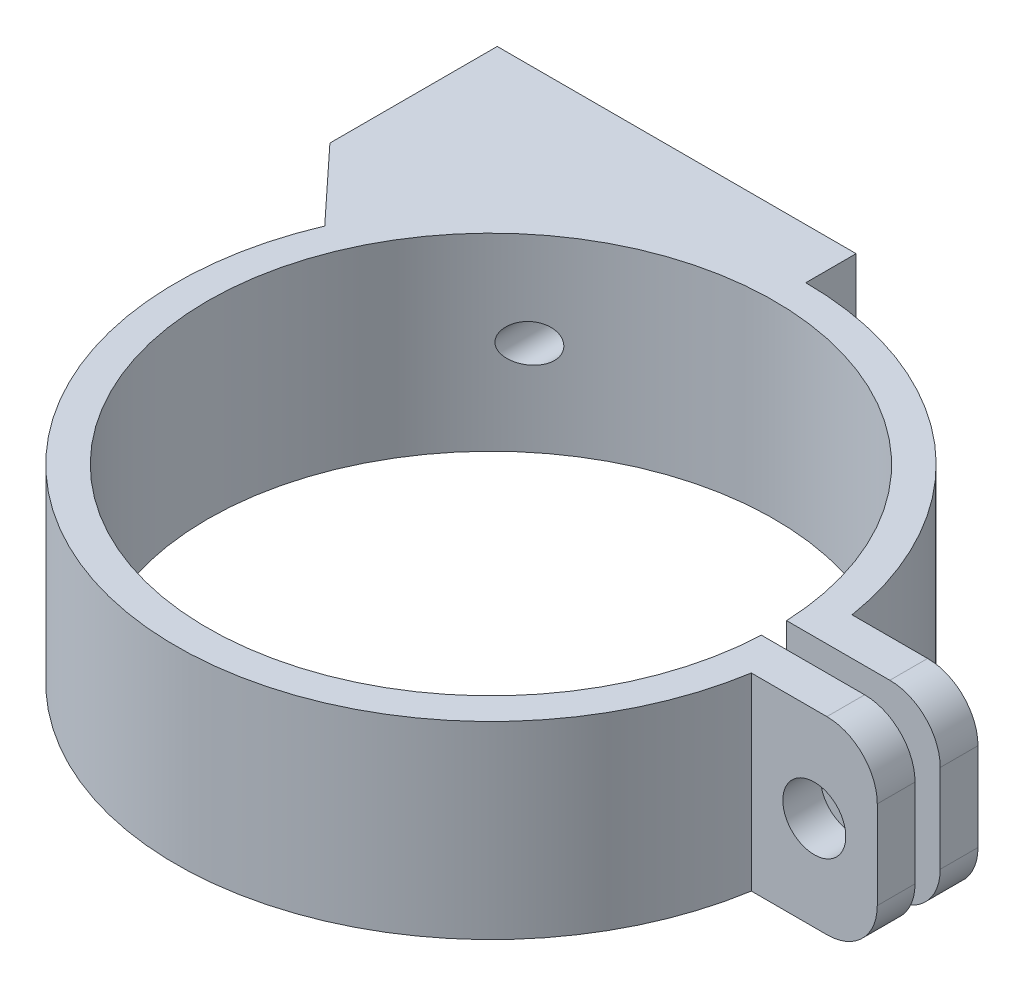
ISO-10303-21;
HEADER;
FILE_DESCRIPTION(('STEP AP214'),'2;1');
FILE_NAME('part.step','',(''),(''),'','','');
FILE_SCHEMA(('AUTOMOTIVE_DESIGN { 1 0 10303 214 1 1 1 1 }'));
ENDSEC;
DATA;
#1=APPLICATION_CONTEXT('core data for automotive mechanical design processes');
#2=APPLICATION_PROTOCOL_DEFINITION('international standard','automotive_design',2000,#1);
#3=PRODUCT_CONTEXT('',#1,'mechanical');
#4=PRODUCT('Part','Part','',(#3));
#5=PRODUCT_RELATED_PRODUCT_CATEGORY('part','',(#4));
#6=PRODUCT_DEFINITION_FORMATION('','',#4);
#7=PRODUCT_DEFINITION_CONTEXT('part definition',#1,'design');
#8=PRODUCT_DEFINITION('design','',#6,#7);
#9=PRODUCT_DEFINITION_SHAPE('','',#8);
#10=(LENGTH_UNIT() NAMED_UNIT(*) SI_UNIT(.MILLI.,.METRE.));
#11=(NAMED_UNIT(*) PLANE_ANGLE_UNIT() SI_UNIT($,.RADIAN.));
#12=(NAMED_UNIT(*) SI_UNIT($,.STERADIAN.) SOLID_ANGLE_UNIT());
#13=UNCERTAINTY_MEASURE_WITH_UNIT(LENGTH_MEASURE(1.E-05),#10,'distance_accuracy_value','');
#14=(GEOMETRIC_REPRESENTATION_CONTEXT(3) GLOBAL_UNCERTAINTY_ASSIGNED_CONTEXT((#13)) GLOBAL_UNIT_ASSIGNED_CONTEXT((#10,
#11,#12)) REPRESENTATION_CONTEXT('',''));
#15=CARTESIAN_POINT('',(0.,0.,0.));
#16=DIRECTION('',(0.,0.,1.));
#17=DIRECTION('',(1.,0.,0.));
#18=AXIS2_PLACEMENT_3D('',#15,#16,#17);
#19=CARTESIAN_POINT('',(0.,15.,0.));
#20=DIRECTION('',(0.,-1.,0.));
#21=DIRECTION('',(0.,0.,-1.));
#22=AXIS2_PLACEMENT_3D('',#19,#20,#21);
#23=CYLINDRICAL_SURFACE('',#22,25.);
#24=CARTESIAN_POINT('',(0.,0.,0.));
#25=DIRECTION('',(0.,1.,0.));
#26=DIRECTION('',(0.,0.,1.));
#27=AXIS2_PLACEMENT_3D('',#24,#25,#26);
#28=CIRCLE('',#27,25.);
#29=CARTESIAN_POINT('',(24.6779253585061,0.,-4.));
#30=VERTEX_POINT('',#29);
#31=CARTESIAN_POINT('',(0.,0.,-25.));
#32=VERTEX_POINT('',#31);
#33=EDGE_CURVE('E181',#30,#32,#28,.T.);
#34=ORIENTED_EDGE('',*,*,#33,.T.);
#35=DIRECTION('',(0.,-1.,0.));
#36=VECTOR('',#35,1.);
#37=CARTESIAN_POINT('',(0.,15.,-25.));
#38=LINE('',#37,#36);
#39=CARTESIAN_POINT('',(0.,15.,-25.));
#40=VERTEX_POINT('',#39);
#41=EDGE_CURVE('E161',#40,#32,#38,.T.);
#42=ORIENTED_EDGE('',*,*,#41,.F.);
#43=CARTESIAN_POINT('',(0.,15.,0.));
#44=DIRECTION('',(0.,1.,0.));
#45=DIRECTION('',(0.,0.,1.));
#46=AXIS2_PLACEMENT_3D('',#43,#44,#45);
#47=CIRCLE('',#46,25.);
#48=CARTESIAN_POINT('',(24.6779253585061,15.,-4.));
#49=VERTEX_POINT('',#48);
#50=EDGE_CURVE('E168',#49,#40,#47,.T.);
#51=ORIENTED_EDGE('',*,*,#50,.F.);
#52=DIRECTION('',(0.,-1.,0.));
#53=VECTOR('',#52,1.);
#54=CARTESIAN_POINT('',(24.6779253585061,15.,-4.));
#55=LINE('',#54,#53);
#56=EDGE_CURVE('E284',#49,#30,#55,.T.);
#57=ORIENTED_EDGE('',*,*,#56,.T.);
#58=EDGE_LOOP('',(#34,#42,#51,#57));
#59=FACE_BOUND('',#58,.T.);
#60=ADVANCED_FACE('F35',(#59),#23,.T.);
#61=CARTESIAN_POINT('',(0.,15.,-25.));
#62=DIRECTION('',(-1.,0.,0.));
#63=DIRECTION('',(0.,0.,1.));
#64=AXIS2_PLACEMENT_3D('',#61,#62,#63);
#65=PLANE('',#64);
#66=DIRECTION('',(0.,0.,-1.));
#67=VECTOR('',#66,1.);
#68=CARTESIAN_POINT('',(0.,0.,-25.));
#69=LINE('',#68,#67);
#70=CARTESIAN_POINT('',(0.,0.,-29.));
#71=VERTEX_POINT('',#70);
#72=EDGE_CURVE('E293',#32,#71,#69,.T.);
#73=ORIENTED_EDGE('',*,*,#72,.T.);
#74=DIRECTION('',(0.,-1.,0.));
#75=VECTOR('',#74,1.);
#76=CARTESIAN_POINT('',(0.,15.,-29.));
#77=LINE('',#76,#75);
#78=CARTESIAN_POINT('',(0.,15.,-29.));
#79=VERTEX_POINT('',#78);
#80=EDGE_CURVE('E164',#79,#71,#77,.T.);
#81=ORIENTED_EDGE('',*,*,#80,.F.);
#82=DIRECTION('',(0.,0.,-1.));
#83=VECTOR('',#82,1.);
#84=CARTESIAN_POINT('',(0.,15.,-25.));
#85=LINE('',#84,#83);
#86=EDGE_CURVE('E157',#40,#79,#85,.T.);
#87=ORIENTED_EDGE('',*,*,#86,.F.);
#88=ORIENTED_EDGE('',*,*,#41,.T.);
#89=EDGE_LOOP('',(#73,#81,#87,#88));
#90=FACE_BOUND('',#89,.T.);
#91=ADVANCED_FACE('F159',(#90),#65,.F.);
#92=CARTESIAN_POINT('',(0.,15.,-29.));
#93=DIRECTION('',(0.,0.,1.));
#94=DIRECTION('',(1.,0.,0.));
#95=AXIS2_PLACEMENT_3D('',#92,#93,#94);
#96=PLANE('',#95);
#97=CARTESIAN_POINT('',(-14.25,7.5,-29.));
#98=DIRECTION('',(0.,0.,-1.));
#99=DIRECTION('',(-1.,0.,0.));
#100=AXIS2_PLACEMENT_3D('',#97,#98,#99);
#101=CIRCLE('',#100,1.5);
#102=CARTESIAN_POINT('',(-15.75,7.5,-29.));
#103=VERTEX_POINT('',#102);
#104=EDGE_CURVE('E197',#103,#103,#101,.T.);
#105=ORIENTED_EDGE('',*,*,#104,.F.);
#106=EDGE_LOOP('',(#105));
#107=FACE_BOUND('',#106,.T.);
#108=DIRECTION('',(-1.,0.,0.));
#109=VECTOR('',#108,1.);
#110=CARTESIAN_POINT('',(0.,0.,-29.));
#111=LINE('',#110,#109);
#112=CARTESIAN_POINT('',(-28.5,0.,-29.));
#113=VERTEX_POINT('',#112);
#114=EDGE_CURVE('E295',#71,#113,#111,.T.);
#115=ORIENTED_EDGE('',*,*,#114,.T.);
#116=DIRECTION('',(0.,-1.,0.));
#117=VECTOR('',#116,1.);
#118=CARTESIAN_POINT('',(-28.5,15.,-29.));
#119=LINE('',#118,#117);
#120=CARTESIAN_POINT('',(-28.5,15.,-29.));
#121=VERTEX_POINT('',#120);
#122=EDGE_CURVE('E186',#121,#113,#119,.T.);
#123=ORIENTED_EDGE('',*,*,#122,.F.);
#124=DIRECTION('',(-1.,0.,0.));
#125=VECTOR('',#124,1.);
#126=CARTESIAN_POINT('',(0.,15.,-29.));
#127=LINE('',#126,#125);
#128=EDGE_CURVE('E167',#79,#121,#127,.T.);
#129=ORIENTED_EDGE('',*,*,#128,.F.);
#130=ORIENTED_EDGE('',*,*,#80,.T.);
#131=EDGE_LOOP('',(#115,#123,#129,#130));
#132=FACE_BOUND('',#131,.T.);
#133=ADVANCED_FACE('F238',(#107,#132),#96,.F.);
#134=CARTESIAN_POINT('',(-28.5,15.,-29.));
#135=DIRECTION('',(1.,0.,0.));
#136=DIRECTION('',(0.,0.,-1.));
#137=AXIS2_PLACEMENT_3D('',#134,#135,#136);
#138=PLANE('',#137);
#139=DIRECTION('',(0.,0.,1.));
#140=VECTOR('',#139,1.);
#141=CARTESIAN_POINT('',(-28.5,0.,-29.));
#142=LINE('',#141,#140);
#143=CARTESIAN_POINT('',(-28.5,0.,-15.7122905027933));
#144=VERTEX_POINT('',#143);
#145=EDGE_CURVE('E297',#113,#144,#142,.T.);
#146=ORIENTED_EDGE('',*,*,#145,.T.);
#147=DIRECTION('',(0.,-1.,0.));
#148=VECTOR('',#147,1.);
#149=CARTESIAN_POINT('',(-28.5,15.,-15.7122905027933));
#150=LINE('',#149,#148);
#151=CARTESIAN_POINT('',(-28.5,15.,-15.7122905027933));
#152=VERTEX_POINT('',#151);
#153=EDGE_CURVE('E336',#152,#144,#150,.T.);
#154=ORIENTED_EDGE('',*,*,#153,.F.);
#155=DIRECTION('',(0.,0.,1.));
#156=VECTOR('',#155,1.);
#157=CARTESIAN_POINT('',(-28.5,15.,-29.));
#158=LINE('',#157,#156);
#159=EDGE_CURVE('E345',#121,#152,#158,.T.);
#160=ORIENTED_EDGE('',*,*,#159,.F.);
#161=ORIENTED_EDGE('',*,*,#122,.T.);
#162=EDGE_LOOP('',(#146,#154,#160,#161));
#163=FACE_BOUND('',#162,.T.);
#164=ADVANCED_FACE('F343',(#163),#138,.F.);
#165=CARTESIAN_POINT('',(-28.5,15.,-15.7122905027933));
#166=DIRECTION('',(0.732073628459375,0.,-0.681225515166839));
#167=DIRECTION('',(-0.681225515166839,0.,-0.732073628459375));
#168=AXIS2_PLACEMENT_3D('',#165,#166,#167);
#169=PLANE('',#168);
#170=DIRECTION('',(0.681225515166839,0.,0.732073628459375));
#171=VECTOR('',#170,1.);
#172=CARTESIAN_POINT('',(-28.5,0.,-15.7122905027933));
#173=LINE('',#172,#171);
#174=CARTESIAN_POINT('',(-22.9988894708076,0.,-9.8005654484614));
#175=VERTEX_POINT('',#174);
#176=EDGE_CURVE('E299',#144,#175,#173,.T.);
#177=ORIENTED_EDGE('',*,*,#176,.T.);
#178=DIRECTION('',(0.,-1.,0.));
#179=VECTOR('',#178,1.);
#180=CARTESIAN_POINT('',(-22.9988894708076,15.,-9.8005654484614));
#181=LINE('',#180,#179);
#182=CARTESIAN_POINT('',(-22.9988894708076,15.,-9.8005654484614));
#183=VERTEX_POINT('',#182);
#184=EDGE_CURVE('E333',#183,#175,#181,.T.);
#185=ORIENTED_EDGE('',*,*,#184,.F.);
#186=DIRECTION('',(0.681225515166839,0.,0.732073628459375));
#187=VECTOR('',#186,1.);
#188=CARTESIAN_POINT('',(-28.5,15.,-15.7122905027933));
#189=LINE('',#188,#187);
#190=EDGE_CURVE('E362',#152,#183,#189,.T.);
#191=ORIENTED_EDGE('',*,*,#190,.F.);
#192=ORIENTED_EDGE('',*,*,#153,.T.);
#193=EDGE_LOOP('',(#177,#185,#191,#192));
#194=FACE_BOUND('',#193,.T.);
#195=ADVANCED_FACE('F354',(#194),#169,.F.);
#196=CARTESIAN_POINT('',(0.,15.,0.));
#197=DIRECTION('',(0.,-1.,0.));
#198=DIRECTION('',(0.,0.,-1.));
#199=AXIS2_PLACEMENT_3D('',#196,#197,#198);
#200=CYLINDRICAL_SURFACE('',#199,25.);
#201=CARTESIAN_POINT('',(0.,0.,0.));
#202=DIRECTION('',(0.,1.,0.));
#203=DIRECTION('',(0.,0.,1.));
#204=AXIS2_PLACEMENT_3D('',#201,#202,#203);
#205=CIRCLE('',#204,25.);
#206=CARTESIAN_POINT('',(24.6779253585061,0.,3.99999999999999));
#207=VERTEX_POINT('',#206);
#208=EDGE_CURVE('E301',#175,#207,#205,.T.);
#209=ORIENTED_EDGE('',*,*,#208,.T.);
#210=DIRECTION('',(0.,-1.,0.));
#211=VECTOR('',#210,1.);
#212=CARTESIAN_POINT('',(24.6779253585061,15.,3.99999999999999));
#213=LINE('',#212,#211);
#214=CARTESIAN_POINT('',(24.6779253585061,15.,3.99999999999999));
#215=VERTEX_POINT('',#214);
#216=EDGE_CURVE('E330',#215,#207,#213,.T.);
#217=ORIENTED_EDGE('',*,*,#216,.F.);
#218=CARTESIAN_POINT('',(0.,15.,0.));
#219=DIRECTION('',(0.,1.,0.));
#220=DIRECTION('',(0.,0.,1.));
#221=AXIS2_PLACEMENT_3D('',#218,#219,#220);
#222=CIRCLE('',#221,25.);
#223=EDGE_CURVE('E360',#183,#215,#222,.T.);
#224=ORIENTED_EDGE('',*,*,#223,.F.);
#225=ORIENTED_EDGE('',*,*,#184,.T.);
#226=EDGE_LOOP('',(#209,#217,#224,#225));
#227=FACE_BOUND('',#226,.T.);
#228=ADVANCED_FACE('F358',(#227),#200,.T.);
#229=CARTESIAN_POINT('',(34.6779253585061,15.,4.));
#230=DIRECTION('',(0.,0.,-1.));
#231=DIRECTION('',(-1.,0.,0.));
#232=AXIS2_PLACEMENT_3D('',#229,#230,#231);
#233=PLANE('',#232);
#234=CARTESIAN_POINT('',(29.6779253585061,7.5,4.));
#235=DIRECTION('',(0.,0.,-1.));
#236=DIRECTION('',(-1.,0.,0.));
#237=AXIS2_PLACEMENT_3D('',#234,#235,#236);
#238=CIRCLE('',#237,2.5);
#239=CARTESIAN_POINT('',(27.1779253585061,7.5,4.));
#240=VERTEX_POINT('',#239);
#241=EDGE_CURVE('E384',#240,#240,#238,.T.);
#242=ORIENTED_EDGE('',*,*,#241,.T.);
#243=EDGE_LOOP('',(#242));
#244=FACE_BOUND('',#243,.T.);
#245=DIRECTION('',(1.,0.,0.));
#246=VECTOR('',#245,1.);
#247=CARTESIAN_POINT('',(34.6779253585061,0.,4.));
#248=LINE('',#247,#246);
#249=CARTESIAN_POINT('',(30.6779253585061,0.,4.));
#250=VERTEX_POINT('',#249);
#251=EDGE_CURVE('E303',#207,#250,#248,.T.);
#252=ORIENTED_EDGE('',*,*,#251,.T.);
#253=CARTESIAN_POINT('',(30.6779253585061,4.,4.));
#254=DIRECTION('',(0.,0.,-1.));
#255=DIRECTION('',(-1.,0.,0.));
#256=AXIS2_PLACEMENT_3D('',#253,#254,#255);
#257=CIRCLE('',#256,4.);
#258=CARTESIAN_POINT('',(34.6779253585061,4.,4.));
#259=VERTEX_POINT('',#258);
#260=EDGE_CURVE('E262',#250,#259,#257,.F.);
#261=ORIENTED_EDGE('',*,*,#260,.T.);
#262=DIRECTION('',(0.,-1.,0.));
#263=VECTOR('',#262,1.);
#264=CARTESIAN_POINT('',(34.6779253585061,15.,4.));
#265=LINE('',#264,#263);
#266=CARTESIAN_POINT('',(34.6779253585061,11.,4.));
#267=VERTEX_POINT('',#266);
#268=EDGE_CURVE('E327',#267,#259,#265,.T.);
#269=ORIENTED_EDGE('',*,*,#268,.F.);
#270=CARTESIAN_POINT('',(30.6779253585061,11.,4.));
#271=DIRECTION('',(0.,0.,-1.));
#272=DIRECTION('',(-1.,0.,0.));
#273=AXIS2_PLACEMENT_3D('',#270,#271,#272);
#274=CIRCLE('',#273,4.);
#275=CARTESIAN_POINT('',(30.6779253585061,15.,4.));
#276=VERTEX_POINT('',#275);
#277=EDGE_CURVE('E258',#267,#276,#274,.F.);
#278=ORIENTED_EDGE('',*,*,#277,.T.);
#279=DIRECTION('',(1.,0.,0.));
#280=VECTOR('',#279,1.);
#281=CARTESIAN_POINT('',(34.6779253585061,15.,4.));
#282=LINE('',#281,#280);
#283=EDGE_CURVE('E361',#215,#276,#282,.T.);
#284=ORIENTED_EDGE('',*,*,#283,.F.);
#285=ORIENTED_EDGE('',*,*,#216,.T.);
#286=EDGE_LOOP('',(#252,#261,#269,#278,#284,#285));
#287=FACE_BOUND('',#286,.T.);
#288=ADVANCED_FACE('F409',(#244,#287),#233,.F.);
#289=CARTESIAN_POINT('',(34.6779253585061,15.,1.));
#290=DIRECTION('',(-1.,0.,0.));
#291=DIRECTION('',(0.,0.,1.));
#292=AXIS2_PLACEMENT_3D('',#289,#290,#291);
#293=PLANE('',#292);
#294=ORIENTED_EDGE('',*,*,#268,.T.);
#295=DIRECTION('',(0.,0.,-1.));
#296=VECTOR('',#295,1.);
#297=CARTESIAN_POINT('',(34.6779253585061,4.,1.));
#298=LINE('',#297,#296);
#299=CARTESIAN_POINT('',(34.6779253585061,4.,1.));
#300=VERTEX_POINT('',#299);
#301=EDGE_CURVE('E184',#259,#300,#298,.T.);
#302=ORIENTED_EDGE('',*,*,#301,.T.);
#303=DIRECTION('',(0.,-1.,0.));
#304=VECTOR('',#303,1.);
#305=CARTESIAN_POINT('',(34.6779253585061,15.,1.));
#306=LINE('',#305,#304);
#307=CARTESIAN_POINT('',(34.6779253585061,11.,1.));
#308=VERTEX_POINT('',#307);
#309=EDGE_CURVE('E324',#308,#300,#306,.T.);
#310=ORIENTED_EDGE('',*,*,#309,.F.);
#311=DIRECTION('',(0.,0.,-1.));
#312=VECTOR('',#311,1.);
#313=CARTESIAN_POINT('',(34.6779253585061,11.,4.));
#314=LINE('',#313,#312);
#315=EDGE_CURVE('E182',#308,#267,#314,.F.);
#316=ORIENTED_EDGE('',*,*,#315,.T.);
#317=EDGE_LOOP('',(#294,#302,#310,#316));
#318=FACE_BOUND('',#317,.T.);
#319=ADVANCED_FACE('F411',(#318),#293,.F.);
#320=CARTESIAN_POINT('',(22.477766792989,15.,1.));
#321=DIRECTION('',(0.,0.,1.));
#322=DIRECTION('',(1.,0.,0.));
#323=AXIS2_PLACEMENT_3D('',#320,#321,#322);
#324=PLANE('',#323);
#325=CARTESIAN_POINT('',(29.6779253585061,7.5,1.));
#326=DIRECTION('',(0.,0.,1.));
#327=DIRECTION('',(1.,0.,0.));
#328=AXIS2_PLACEMENT_3D('',#325,#326,#327);
#329=CIRCLE('',#328,2.5);
#330=CARTESIAN_POINT('',(32.1779253585061,7.5,1.));
#331=VERTEX_POINT('',#330);
#332=EDGE_CURVE('E387',#331,#331,#329,.T.);
#333=ORIENTED_EDGE('',*,*,#332,.T.);
#334=EDGE_LOOP('',(#333));
#335=FACE_BOUND('',#334,.T.);
#336=ORIENTED_EDGE('',*,*,#309,.T.);
#337=CARTESIAN_POINT('',(30.6779253585061,4.,1.));
#338=DIRECTION('',(0.,0.,1.));
#339=DIRECTION('',(1.,0.,0.));
#340=AXIS2_PLACEMENT_3D('',#337,#338,#339);
#341=CIRCLE('',#340,4.);
#342=CARTESIAN_POINT('',(30.6779253585061,0.,1.));
#343=VERTEX_POINT('',#342);
#344=EDGE_CURVE('E417',#300,#343,#341,.F.);
#345=ORIENTED_EDGE('',*,*,#344,.T.);
#346=DIRECTION('',(-1.,0.,0.));
#347=VECTOR('',#346,1.);
#348=CARTESIAN_POINT('',(22.477766792989,0.,1.));
#349=LINE('',#348,#347);
#350=CARTESIAN_POINT('',(22.477766792989,0.,1.));
#351=VERTEX_POINT('',#350);
#352=EDGE_CURVE('E306',#343,#351,#349,.T.);
#353=ORIENTED_EDGE('',*,*,#352,.T.);
#354=DIRECTION('',(0.,-1.,0.));
#355=VECTOR('',#354,1.);
#356=CARTESIAN_POINT('',(22.477766792989,15.,1.));
#357=LINE('',#356,#355);
#358=CARTESIAN_POINT('',(22.477766792989,15.,1.));
#359=VERTEX_POINT('',#358);
#360=EDGE_CURVE('E321',#359,#351,#357,.T.);
#361=ORIENTED_EDGE('',*,*,#360,.F.);
#362=DIRECTION('',(-1.,0.,0.));
#363=VECTOR('',#362,1.);
#364=CARTESIAN_POINT('',(22.477766792989,15.,1.));
#365=LINE('',#364,#363);
#366=CARTESIAN_POINT('',(30.6779253585061,15.,1.));
#367=VERTEX_POINT('',#366);
#368=EDGE_CURVE('E364',#367,#359,#365,.T.);
#369=ORIENTED_EDGE('',*,*,#368,.F.);
#370=CARTESIAN_POINT('',(30.6779253585061,11.,1.));
#371=DIRECTION('',(0.,0.,1.));
#372=DIRECTION('',(1.,0.,0.));
#373=AXIS2_PLACEMENT_3D('',#370,#371,#372);
#374=CIRCLE('',#373,4.);
#375=EDGE_CURVE('E420',#367,#308,#374,.F.);
#376=ORIENTED_EDGE('',*,*,#375,.T.);
#377=EDGE_LOOP('',(#336,#345,#353,#361,#369,#376));
#378=FACE_BOUND('',#377,.T.);
#379=ADVANCED_FACE('F230',(#335,#378),#324,.F.);
#380=CARTESIAN_POINT('',(0.,15.,0.));
#381=DIRECTION('',(0.,-1.,0.));
#382=DIRECTION('',(0.,0.,-1.));
#383=AXIS2_PLACEMENT_3D('',#380,#381,#382);
#384=CYLINDRICAL_SURFACE('',#383,22.5);
#385=CARTESIAN_POINT('',(-15.75,7.5,-16.0682139642214));
#386=CARTESIAN_POINT('',(-15.7499950303171,7.56768873001703,-16.0682192478693));
#387=CARTESIAN_POINT('',(-15.7453722135397,7.63549676756473,-16.0727541051918));
#388=CARTESIAN_POINT('',(-15.7272558247097,7.76883313585536,-16.090480873753));
#389=CARTESIAN_POINT('',(-15.7137384641802,7.8343548555986,-16.1036960002223));
#390=CARTESIAN_POINT('',(-15.678994819776,7.96068877812405,-16.1375244657337));
#391=CARTESIAN_POINT('',(-15.6578281760573,8.02153311604476,-16.1580805542978));
#392=CARTESIAN_POINT('',(-15.609031710894,8.13798677094461,-16.2052238632588));
#393=CARTESIAN_POINT('',(-15.5814013793434,8.19359567426393,-16.2318115596575));
#394=CARTESIAN_POINT('',(-15.5081774932229,8.3212401921433,-16.3018383407144));
#395=CARTESIAN_POINT('',(-15.4599035855491,8.39042249767986,-16.3476751772721));
#396=CARTESIAN_POINT('',(-15.3554287036742,8.51725580320652,-16.4458500379552));
#397=CARTESIAN_POINT('',(-15.2992098061979,8.57487999765767,-16.4982027285689));
#398=CARTESIAN_POINT('',(-15.1616191152299,8.69575942909412,-16.6248792051321));
#399=CARTESIAN_POINT('',(-15.0780067208374,8.75476947472637,-16.7008181124411));
#400=CARTESIAN_POINT('',(-14.9036456250751,8.85381372985512,-16.8566031631169));
#401=CARTESIAN_POINT('',(-14.8128930508023,8.8938375571548,-16.936451417959));
#402=CARTESIAN_POINT('',(-14.6250876790265,8.95575790482149,-17.0989021712391));
#403=CARTESIAN_POINT('',(-14.5279581876402,8.97735911742376,-17.1815282401027));
#404=CARTESIAN_POINT('',(-14.3308410243181,9.00110745565284,-17.3462824066806));
#405=CARTESIAN_POINT('',(-14.2308516958164,9.00324306709092,-17.4284101809506));
#406=CARTESIAN_POINT('',(-14.0204396273612,8.98644661589706,-17.5982181992764));
#407=CARTESIAN_POINT('',(-13.9099650471447,8.96540546510232,-17.6856419779803));
#408=CARTESIAN_POINT('',(-13.6925319220076,8.89719623121646,-17.8545066064545));
#409=CARTESIAN_POINT('',(-13.5855675031355,8.85007443083495,-17.9359577660819));
#410=CARTESIAN_POINT('',(-13.4135720497338,8.74778235273986,-18.0647096647776));
#411=CARTESIAN_POINT('',(-13.3460638577025,8.69999608554166,-18.1146058216489));
#412=CARTESIAN_POINT('',(-13.2176714665949,8.59148360390591,-18.2084993006089));
#413=CARTESIAN_POINT('',(-13.1567777850284,8.53077629281544,-18.2525050886789));
#414=CARTESIAN_POINT('',(-13.053332107676,8.40741684110062,-18.3265907138831));
#415=CARTESIAN_POINT('',(-13.0094022031767,8.34658577772699,-18.3577722888633));
#416=CARTESIAN_POINT('',(-12.9301662421479,8.21680485117553,-18.4136675642347));
#417=CARTESIAN_POINT('',(-12.8948580358818,8.14785701820304,-18.4383828770355));
#418=CARTESIAN_POINT('',(-12.8346133531738,8.00286944996958,-18.4803698409325));
#419=CARTESIAN_POINT('',(-12.8097423420444,7.92678850876848,-18.4975945322691));
#420=CARTESIAN_POINT('',(-12.7723572416904,7.77024605134517,-18.5234289681493));
#421=CARTESIAN_POINT('',(-12.7598352576122,7.68978736862237,-18.5320442168408));
#422=CARTESIAN_POINT('',(-12.7487033940216,7.53657474063134,-18.5397032219552));
#423=CARTESIAN_POINT('',(-12.7486926666965,7.46396692288718,-18.5397107561282));
#424=CARTESIAN_POINT('',(-12.7591046075386,7.31987838736186,-18.5325467722488));
#425=CARTESIAN_POINT('',(-12.7695247054696,7.24839739632921,-18.5253770227348));
#426=CARTESIAN_POINT('',(-12.7996622074047,7.11102463886839,-18.5045660174116));
#427=CARTESIAN_POINT('',(-12.8190533315834,7.04502560982444,-18.4911517775347));
#428=CARTESIAN_POINT('',(-12.8660268732123,6.91756099728807,-18.4584984898343));
#429=CARTESIAN_POINT('',(-12.8936107026856,6.85609619755732,-18.4392584379137));
#430=CARTESIAN_POINT('',(-12.9579206446563,6.73477825678935,-18.3941276802589));
#431=CARTESIAN_POINT('',(-12.9951457214339,6.67532795895846,-18.3678700756446));
#432=CARTESIAN_POINT('',(-13.0760595963553,6.56371877712421,-18.3103557985603));
#433=CARTESIAN_POINT('',(-13.1197512605843,6.51156314626109,-18.2790969089483));
#434=CARTESIAN_POINT('',(-13.2188307528661,6.40796449871719,-18.2076015188331));
#435=CARTESIAN_POINT('',(-13.2749963963915,6.35771326234955,-18.1667204462258));
#436=CARTESIAN_POINT('',(-13.3919921854063,6.2674037614359,-18.0806480098693));
#437=CARTESIAN_POINT('',(-13.4528250869193,6.22735158067777,-18.0354540954794));
#438=CARTESIAN_POINT('',(-13.5894692354913,6.15057305751344,-17.9327892777566));
#439=CARTESIAN_POINT('',(-13.6659265448346,6.11593304578804,-17.8746195083965));
#440=CARTESIAN_POINT('',(-13.8210920527577,6.06026301473647,-17.7549161137088));
#441=CARTESIAN_POINT('',(-13.8998014955792,6.03924067654256,-17.6933806111011));
#442=CARTESIAN_POINT('',(-14.0734065603511,6.00733079967689,-17.5557330518886));
#443=CARTESIAN_POINT('',(-14.1684380467118,5.99925340793181,-17.4791363574662));
#444=CARTESIAN_POINT('',(-14.357201974174,6.00085615833177,-17.3244246886175));
#445=CARTESIAN_POINT('',(-14.4509327877392,6.01055682547464,-17.2463080624375));
#446=CARTESIAN_POINT('',(-14.6481065279788,6.04982959304303,-17.0792828467963));
#447=CARTESIAN_POINT('',(-14.7510631965539,6.08200269331224,-16.9904003908649));
#448=CARTESIAN_POINT('',(-14.9499003806814,6.16887262879292,-16.8157050142344));
#449=CARTESIAN_POINT('',(-15.0457862241575,6.22355229634255,-16.729889807992));
#450=CARTESIAN_POINT('',(-15.2015355832941,6.33762583979418,-16.5882831918316));
#451=CARTESIAN_POINT('',(-15.2639750135912,6.39142709456883,-16.5308057717073));
#452=CARTESIAN_POINT('',(-15.3813904933306,6.51157340479921,-16.4216079956069));
#453=CARTESIAN_POINT('',(-15.4363793237233,6.57789649977437,-16.3698778088512));
#454=CARTESIAN_POINT('',(-15.5242778457869,6.7058252579928,-16.2864839708442));
#455=CARTESIAN_POINT('',(-15.5593216237279,6.76475837866531,-16.2529813027318));
#456=CARTESIAN_POINT('',(-15.6219981975078,6.88968447019075,-16.1927471404898));
#457=CARTESIAN_POINT('',(-15.6496373557293,6.95567131151195,-16.1660098343606));
#458=CARTESIAN_POINT('',(-15.6919061006023,7.08215747839939,-16.124974656712));
#459=CARTESIAN_POINT('',(-15.7079315751506,7.14175823843799,-16.1093505422643));
#460=CARTESIAN_POINT('',(-15.7325848416547,7.26379805875086,-16.0852752111369));
#461=CARTESIAN_POINT('',(-15.7412324411891,7.32622904244789,-16.0768047893693));
#462=CARTESIAN_POINT('',(-15.7472639706569,7.40756338633118,-16.0708953905719));
#463=CARTESIAN_POINT('',(-15.7482884566772,7.42601784723274,-16.0698914713841));
#464=CARTESIAN_POINT('',(-15.7496572069428,7.46297855784622,-16.068549980815));
#465=CARTESIAN_POINT('',(-15.7500013593784,7.48148481557033,-16.0682125189629));
#466=CARTESIAN_POINT('',(-15.75,7.5,-16.0682139642214));
#467=B_SPLINE_CURVE_WITH_KNOTS('',3,(#385,#386,#387,#388,#389,#390,#391,#392,#393,#394,#395,
#396,#397,#398,#399,#400,#401,#402,#403,#404,#405,#406,#407,#408,#409,#410,#411,#412,#413,#414,
#415,#416,#417,#418,#419,#420,#421,#422,#423,#424,#425,#426,#427,#428,#429,#430,#431,#432,#433,
#434,#435,#436,#437,#438,#439,#440,#441,#442,#443,#444,#445,#446,#447,#448,#449,#450,#451,#452,
#453,#454,#455,#456,#457,#458,#459,#460,#461,#462,#463,#464,#465,#466),.UNSPECIFIED.,.T.,.F.,(4,
2,2,2,2,2,2,2,2,2,2,2,2,2,2,2,2,2,2,2,2,2,2,2,2,2,2,2,2,2,2,2,2,2,2,2,2,2,2,2,4),(0.,
0.202979900052729,0.406504888928386,0.608476104502032,0.810463264766657,1.09690432949445,
1.38400221579739,1.76430513214221,2.1448157697479,2.53131698227939,2.9180468011237,
3.34310709157772,3.76741547761596,4.05613157434004,4.34442815074883,4.58719711270522,
4.82990548062691,5.07411422453548,5.31816674200008,5.53489047787203,5.75156082447578,
5.96090497204606,6.17028522130158,6.39409205239987,6.61799837662307,6.87425611427734,
7.13066635476445,7.43591246463355,7.74133060086275,8.1068785525337,8.47284879991211,
8.89024975770891,9.30733291680236,9.60780101879963,9.90774698180411,10.1358774216175,
10.3638112081828,10.5540309677528,10.7437384176336,10.7992512451362,10.8547731951573),.UNSPECIFIED.);
#468=CARTESIAN_POINT('',(-15.75,7.5,-16.0682139642214));
#469=VERTEX_POINT('',#468);
#470=EDGE_CURVE('E190',#469,#469,#467,.T.);
#471=ORIENTED_EDGE('',*,*,#470,.T.);
#472=EDGE_LOOP('',(#471));
#473=FACE_BOUND('',#472,.T.);
#474=CARTESIAN_POINT('',(0.,0.,0.));
#475=DIRECTION('',(0.,-1.,0.));
#476=DIRECTION('',(0.,0.,1.));
#477=AXIS2_PLACEMENT_3D('',#474,#475,#476);
#478=CIRCLE('',#477,22.5);
#479=CARTESIAN_POINT('',(22.477766792989,0.,-0.999999999999999));
#480=VERTEX_POINT('',#479);
#481=EDGE_CURVE('E308',#351,#480,#478,.T.);
#482=ORIENTED_EDGE('',*,*,#481,.T.);
#483=DIRECTION('',(0.,-1.,0.));
#484=VECTOR('',#483,1.);
#485=CARTESIAN_POINT('',(22.477766792989,15.,-0.999999999999999));
#486=LINE('',#485,#484);
#487=CARTESIAN_POINT('',(22.477766792989,15.,-0.999999999999999));
#488=VERTEX_POINT('',#487);
#489=EDGE_CURVE('E318',#488,#480,#486,.T.);
#490=ORIENTED_EDGE('',*,*,#489,.F.);
#491=CARTESIAN_POINT('',(0.,15.,0.));
#492=DIRECTION('',(0.,-1.,0.));
#493=DIRECTION('',(0.,0.,1.));
#494=AXIS2_PLACEMENT_3D('',#491,#492,#493);
#495=CIRCLE('',#494,22.5);
#496=EDGE_CURVE('E288',#359,#488,#495,.T.);
#497=ORIENTED_EDGE('',*,*,#496,.F.);
#498=ORIENTED_EDGE('',*,*,#360,.T.);
#499=EDGE_LOOP('',(#482,#490,#497,#498));
#500=FACE_BOUND('',#499,.T.);
#501=ADVANCED_FACE('F199',(#473,#500),#384,.F.);
#502=CARTESIAN_POINT('',(22.477766792989,15.,-1.));
#503=DIRECTION('',(0.,0.,-1.));
#504=DIRECTION('',(-1.,0.,0.));
#505=AXIS2_PLACEMENT_3D('',#502,#503,#504);
#506=PLANE('',#505);
#507=CARTESIAN_POINT('',(29.6779253585061,7.5,-1.));
#508=DIRECTION('',(0.,0.,-1.));
#509=DIRECTION('',(-1.,0.,0.));
#510=AXIS2_PLACEMENT_3D('',#507,#508,#509);
#511=CIRCLE('',#510,2.5);
#512=CARTESIAN_POINT('',(27.1779253585061,7.5,-1.));
#513=VERTEX_POINT('',#512);
#514=EDGE_CURVE('E390',#513,#513,#511,.T.);
#515=ORIENTED_EDGE('',*,*,#514,.T.);
#516=EDGE_LOOP('',(#515));
#517=FACE_BOUND('',#516,.T.);
#518=DIRECTION('',(1.,0.,0.));
#519=VECTOR('',#518,1.);
#520=CARTESIAN_POINT('',(22.477766792989,0.,-1.));
#521=LINE('',#520,#519);
#522=CARTESIAN_POINT('',(30.6779253585061,0.,-1.));
#523=VERTEX_POINT('',#522);
#524=EDGE_CURVE('E310',#480,#523,#521,.T.);
#525=ORIENTED_EDGE('',*,*,#524,.T.);
#526=CARTESIAN_POINT('',(30.6779253585061,4.,-1.));
#527=DIRECTION('',(0.,0.,-1.));
#528=DIRECTION('',(-1.,0.,0.));
#529=AXIS2_PLACEMENT_3D('',#526,#527,#528);
#530=CIRCLE('',#529,4.);
#531=CARTESIAN_POINT('',(34.6779253585061,4.,-1.));
#532=VERTEX_POINT('',#531);
#533=EDGE_CURVE('E279',#523,#532,#530,.F.);
#534=ORIENTED_EDGE('',*,*,#533,.T.);
#535=DIRECTION('',(0.,-1.,0.));
#536=VECTOR('',#535,1.);
#537=CARTESIAN_POINT('',(34.6779253585061,15.,-1.));
#538=LINE('',#537,#536);
#539=CARTESIAN_POINT('',(34.6779253585061,11.,-1.));
#540=VERTEX_POINT('',#539);
#541=EDGE_CURVE('E315',#540,#532,#538,.T.);
#542=ORIENTED_EDGE('',*,*,#541,.F.);
#543=CARTESIAN_POINT('',(30.6779253585061,11.,-1.));
#544=DIRECTION('',(0.,0.,-1.));
#545=DIRECTION('',(-1.,0.,0.));
#546=AXIS2_PLACEMENT_3D('',#543,#544,#545);
#547=CIRCLE('',#546,4.);
#548=CARTESIAN_POINT('',(30.6779253585061,15.,-1.));
#549=VERTEX_POINT('',#548);
#550=EDGE_CURVE('E50',#540,#549,#547,.F.);
#551=ORIENTED_EDGE('',*,*,#550,.T.);
#552=DIRECTION('',(1.,0.,0.));
#553=VECTOR('',#552,1.);
#554=CARTESIAN_POINT('',(22.477766792989,15.,-1.));
#555=LINE('',#554,#553);
#556=EDGE_CURVE('E280',#488,#549,#555,.T.);
#557=ORIENTED_EDGE('',*,*,#556,.F.);
#558=ORIENTED_EDGE('',*,*,#489,.T.);
#559=EDGE_LOOP('',(#525,#534,#542,#551,#557,#558));
#560=FACE_BOUND('',#559,.T.);
#561=ADVANCED_FACE('F223',(#517,#560),#506,.F.);
#562=CARTESIAN_POINT('',(34.6779253585061,15.,-1.));
#563=DIRECTION('',(-1.,0.,0.));
#564=DIRECTION('',(0.,0.,1.));
#565=AXIS2_PLACEMENT_3D('',#562,#563,#564);
#566=PLANE('',#565);
#567=ORIENTED_EDGE('',*,*,#541,.T.);
#568=DIRECTION('',(0.,0.,-1.));
#569=VECTOR('',#568,1.);
#570=CARTESIAN_POINT('',(34.6779253585061,4.,-1.));
#571=LINE('',#570,#569);
#572=CARTESIAN_POINT('',(34.6779253585061,4.,-4.));
#573=VERTEX_POINT('',#572);
#574=EDGE_CURVE('E272',#532,#573,#571,.T.);
#575=ORIENTED_EDGE('',*,*,#574,.T.);
#576=DIRECTION('',(0.,-1.,0.));
#577=VECTOR('',#576,1.);
#578=CARTESIAN_POINT('',(34.6779253585061,15.,-4.));
#579=LINE('',#578,#577);
#580=CARTESIAN_POINT('',(34.6779253585061,11.,-4.));
#581=VERTEX_POINT('',#580);
#582=EDGE_CURVE('E286',#581,#573,#579,.T.);
#583=ORIENTED_EDGE('',*,*,#582,.F.);
#584=DIRECTION('',(0.,0.,-1.));
#585=VECTOR('',#584,1.);
#586=CARTESIAN_POINT('',(34.6779253585061,11.,-1.));
#587=LINE('',#586,#585);
#588=EDGE_CURVE('E265',#581,#540,#587,.F.);
#589=ORIENTED_EDGE('',*,*,#588,.T.);
#590=EDGE_LOOP('',(#567,#575,#583,#589));
#591=FACE_BOUND('',#590,.T.);
#592=ADVANCED_FACE('F220',(#591),#566,.F.);
#593=CARTESIAN_POINT('',(34.6779253585061,15.,-4.));
#594=DIRECTION('',(0.,0.,1.));
#595=DIRECTION('',(1.,0.,0.));
#596=AXIS2_PLACEMENT_3D('',#593,#594,#595);
#597=PLANE('',#596);
#598=CARTESIAN_POINT('',(29.6779253585061,7.5,-4.));
#599=DIRECTION('',(0.,0.,-1.));
#600=DIRECTION('',(-1.,0.,0.));
#601=AXIS2_PLACEMENT_3D('',#598,#599,#600);
#602=CIRCLE('',#601,2.5);
#603=CARTESIAN_POINT('',(27.1779253585061,7.5,-4.));
#604=VERTEX_POINT('',#603);
#605=EDGE_CURVE('E392',#604,#604,#602,.T.);
#606=ORIENTED_EDGE('',*,*,#605,.F.);
#607=EDGE_LOOP('',(#606));
#608=FACE_BOUND('',#607,.T.);
#609=ORIENTED_EDGE('',*,*,#582,.T.);
#610=CARTESIAN_POINT('',(30.6779253585061,4.,-4.));
#611=DIRECTION('',(0.,0.,1.));
#612=DIRECTION('',(1.,0.,0.));
#613=AXIS2_PLACEMENT_3D('',#610,#611,#612);
#614=CIRCLE('',#613,4.);
#615=CARTESIAN_POINT('',(30.6779253585061,0.,-4.));
#616=VERTEX_POINT('',#615);
#617=EDGE_CURVE('E276',#573,#616,#614,.F.);
#618=ORIENTED_EDGE('',*,*,#617,.T.);
#619=DIRECTION('',(-1.,0.,0.));
#620=VECTOR('',#619,1.);
#621=CARTESIAN_POINT('',(34.6779253585061,0.,-4.));
#622=LINE('',#621,#620);
#623=EDGE_CURVE('E178',#616,#30,#622,.T.);
#624=ORIENTED_EDGE('',*,*,#623,.T.);
#625=ORIENTED_EDGE('',*,*,#56,.F.);
#626=DIRECTION('',(-1.,0.,0.));
#627=VECTOR('',#626,1.);
#628=CARTESIAN_POINT('',(34.6779253585061,15.,-4.));
#629=LINE('',#628,#627);
#630=CARTESIAN_POINT('',(30.6779253585061,15.,-4.));
#631=VERTEX_POINT('',#630);
#632=EDGE_CURVE('E174',#631,#49,#629,.T.);
#633=ORIENTED_EDGE('',*,*,#632,.F.);
#634=CARTESIAN_POINT('',(30.6779253585061,11.,-4.));
#635=DIRECTION('',(0.,0.,1.));
#636=DIRECTION('',(1.,0.,0.));
#637=AXIS2_PLACEMENT_3D('',#634,#635,#636);
#638=CIRCLE('',#637,4.);
#639=EDGE_CURVE('E58',#631,#581,#638,.F.);
#640=ORIENTED_EDGE('',*,*,#639,.T.);
#641=EDGE_LOOP('',(#609,#618,#624,#625,#633,#640));
#642=FACE_BOUND('',#641,.T.);
#643=ADVANCED_FACE('F214',(#608,#642),#597,.F.);
#644=CARTESIAN_POINT('',(0.,15.,0.));
#645=DIRECTION('',(0.,1.,0.));
#646=DIRECTION('',(0.,0.,1.));
#647=AXIS2_PLACEMENT_3D('',#644,#645,#646);
#648=PLANE('',#647);
#649=ORIENTED_EDGE('',*,*,#283,.T.);
#650=DIRECTION('',(0.,0.,-1.));
#651=VECTOR('',#650,1.);
#652=CARTESIAN_POINT('',(30.6779253585061,15.,1.));
#653=LINE('',#652,#651);
#654=EDGE_CURVE('E11',#276,#367,#653,.T.);
#655=ORIENTED_EDGE('',*,*,#654,.T.);
#656=ORIENTED_EDGE('',*,*,#368,.T.);
#657=ORIENTED_EDGE('',*,*,#496,.T.);
#658=ORIENTED_EDGE('',*,*,#556,.T.);
#659=DIRECTION('',(0.,0.,-1.));
#660=VECTOR('',#659,1.);
#661=CARTESIAN_POINT('',(30.6779253585061,15.,-4.));
#662=LINE('',#661,#660);
#663=EDGE_CURVE('E43',#549,#631,#662,.T.);
#664=ORIENTED_EDGE('',*,*,#663,.T.);
#665=ORIENTED_EDGE('',*,*,#632,.T.);
#666=ORIENTED_EDGE('',*,*,#50,.T.);
#667=ORIENTED_EDGE('',*,*,#86,.T.);
#668=ORIENTED_EDGE('',*,*,#128,.T.);
#669=ORIENTED_EDGE('',*,*,#159,.T.);
#670=ORIENTED_EDGE('',*,*,#190,.T.);
#671=ORIENTED_EDGE('',*,*,#223,.T.);
#672=EDGE_LOOP('',(#649,#655,#656,#657,#658,#664,#665,#666,#667,#668,#669,#670,#671));
#673=FACE_BOUND('',#672,.T.);
#674=ADVANCED_FACE('F172',(#673),#648,.T.);
#675=CARTESIAN_POINT('',(0.,0.,0.));
#676=DIRECTION('',(0.,1.,0.));
#677=DIRECTION('',(0.,0.,1.));
#678=AXIS2_PLACEMENT_3D('',#675,#676,#677);
#679=PLANE('',#678);
#680=ORIENTED_EDGE('',*,*,#352,.F.);
#681=DIRECTION('',(0.,0.,-1.));
#682=VECTOR('',#681,1.);
#683=CARTESIAN_POINT('',(30.6779253585061,0.,0.));
#684=LINE('',#683,#682);
#685=EDGE_CURVE('E263',#343,#250,#684,.F.);
#686=ORIENTED_EDGE('',*,*,#685,.T.);
#687=ORIENTED_EDGE('',*,*,#251,.F.);
#688=ORIENTED_EDGE('',*,*,#208,.F.);
#689=ORIENTED_EDGE('',*,*,#176,.F.);
#690=ORIENTED_EDGE('',*,*,#145,.F.);
#691=ORIENTED_EDGE('',*,*,#114,.F.);
#692=ORIENTED_EDGE('',*,*,#72,.F.);
#693=ORIENTED_EDGE('',*,*,#33,.F.);
#694=ORIENTED_EDGE('',*,*,#623,.F.);
#695=DIRECTION('',(0.,0.,-1.));
#696=VECTOR('',#695,1.);
#697=CARTESIAN_POINT('',(30.6779253585061,0.,0.));
#698=LINE('',#697,#696);
#699=EDGE_CURVE('E267',#616,#523,#698,.F.);
#700=ORIENTED_EDGE('',*,*,#699,.T.);
#701=ORIENTED_EDGE('',*,*,#524,.F.);
#702=ORIENTED_EDGE('',*,*,#481,.F.);
#703=EDGE_LOOP('',(#680,#686,#687,#688,#689,#690,#691,#692,#693,#694,#700,#701,#702));
#704=FACE_BOUND('',#703,.T.);
#705=ADVANCED_FACE('F209',(#704),#679,.F.);
#706=CARTESIAN_POINT('',(-14.25,7.5,-12.));
#707=DIRECTION('',(0.,0.,-1.));
#708=DIRECTION('',(-1.,0.,0.));
#709=AXIS2_PLACEMENT_3D('',#706,#707,#708);
#710=CYLINDRICAL_SURFACE('',#709,1.5);
#711=ORIENTED_EDGE('',*,*,#104,.T.);
#712=EDGE_LOOP('',(#711));
#713=FACE_BOUND('',#712,.T.);
#714=ORIENTED_EDGE('',*,*,#470,.F.);
#715=EDGE_LOOP('',(#714));
#716=FACE_BOUND('',#715,.T.);
#717=ADVANCED_FACE('F203',(#713,#716),#710,.F.);
#718=CARTESIAN_POINT('',(29.6779253585061,7.5,13.));
#719=DIRECTION('',(0.,0.,-1.));
#720=DIRECTION('',(-1.,0.,0.));
#721=AXIS2_PLACEMENT_3D('',#718,#719,#720);
#722=CYLINDRICAL_SURFACE('',#721,2.5);
#723=ORIENTED_EDGE('',*,*,#605,.T.);
#724=EDGE_LOOP('',(#723));
#725=FACE_BOUND('',#724,.T.);
#726=ORIENTED_EDGE('',*,*,#514,.F.);
#727=EDGE_LOOP('',(#726));
#728=FACE_BOUND('',#727,.T.);
#729=ADVANCED_FACE('F208',(#725,#728),#722,.F.);
#730=ORIENTED_EDGE('',*,*,#332,.F.);
#731=EDGE_LOOP('',(#730));
#732=FACE_BOUND('',#731,.T.);
#733=ORIENTED_EDGE('',*,*,#241,.F.);
#734=EDGE_LOOP('',(#733));
#735=FACE_BOUND('',#734,.T.);
#736=ADVANCED_FACE('F211',(#732,#735),#722,.F.);
#737=CARTESIAN_POINT('',(30.6779253585061,4.,1.));
#738=DIRECTION('',(0.,0.,-1.));
#739=DIRECTION('',(-1.,0.,0.));
#740=AXIS2_PLACEMENT_3D('',#737,#738,#739);
#741=CYLINDRICAL_SURFACE('',#740,4.);
#742=ORIENTED_EDGE('',*,*,#260,.F.);
#743=ORIENTED_EDGE('',*,*,#685,.F.);
#744=ORIENTED_EDGE('',*,*,#344,.F.);
#745=ORIENTED_EDGE('',*,*,#301,.F.);
#746=EDGE_LOOP('',(#742,#743,#744,#745));
#747=FACE_BOUND('',#746,.T.);
#748=ADVANCED_FACE('F242',(#747),#741,.T.);
#749=CARTESIAN_POINT('',(30.6779253585061,4.,-1.));
#750=DIRECTION('',(0.,0.,-1.));
#751=DIRECTION('',(-1.,0.,0.));
#752=AXIS2_PLACEMENT_3D('',#749,#750,#751);
#753=CYLINDRICAL_SURFACE('',#752,4.);
#754=ORIENTED_EDGE('',*,*,#533,.F.);
#755=ORIENTED_EDGE('',*,*,#699,.F.);
#756=ORIENTED_EDGE('',*,*,#617,.F.);
#757=ORIENTED_EDGE('',*,*,#574,.F.);
#758=EDGE_LOOP('',(#754,#755,#756,#757));
#759=FACE_BOUND('',#758,.T.);
#760=ADVANCED_FACE('F245',(#759),#753,.T.);
#761=CARTESIAN_POINT('',(30.6779253585061,11.,0.));
#762=DIRECTION('',(0.,0.,1.));
#763=DIRECTION('',(1.,0.,0.));
#764=AXIS2_PLACEMENT_3D('',#761,#762,#763);
#765=CYLINDRICAL_SURFACE('',#764,4.);
#766=ORIENTED_EDGE('',*,*,#277,.F.);
#767=ORIENTED_EDGE('',*,*,#315,.F.);
#768=ORIENTED_EDGE('',*,*,#375,.F.);
#769=ORIENTED_EDGE('',*,*,#654,.F.);
#770=EDGE_LOOP('',(#766,#767,#768,#769));
#771=FACE_BOUND('',#770,.T.);
#772=ADVANCED_FACE('F248',(#771),#765,.T.);
#773=CARTESIAN_POINT('',(30.6779253585061,11.,0.));
#774=DIRECTION('',(0.,0.,1.));
#775=DIRECTION('',(1.,0.,0.));
#776=AXIS2_PLACEMENT_3D('',#773,#774,#775);
#777=CYLINDRICAL_SURFACE('',#776,4.);
#778=ORIENTED_EDGE('',*,*,#550,.F.);
#779=ORIENTED_EDGE('',*,*,#588,.F.);
#780=ORIENTED_EDGE('',*,*,#639,.F.);
#781=ORIENTED_EDGE('',*,*,#663,.F.);
#782=EDGE_LOOP('',(#778,#779,#780,#781));
#783=FACE_BOUND('',#782,.T.);
#784=ADVANCED_FACE('F37',(#783),#777,.T.);
#785=CLOSED_SHELL('',(#60,#91,#133,#164,#195,#228,#288,#319,#379,#501,#561,#592,#643,#674,#705,
#717,#729,#736,#748,#760,#772,#784));
#786=MANIFOLD_SOLID_BREP('B2',#785);
#787=ADVANCED_BREP_SHAPE_REPRESENTATION('',(#18,#786),#14);
#788=SHAPE_DEFINITION_REPRESENTATION(#9,#787);
ENDSEC;
END-ISO-10303-21;
